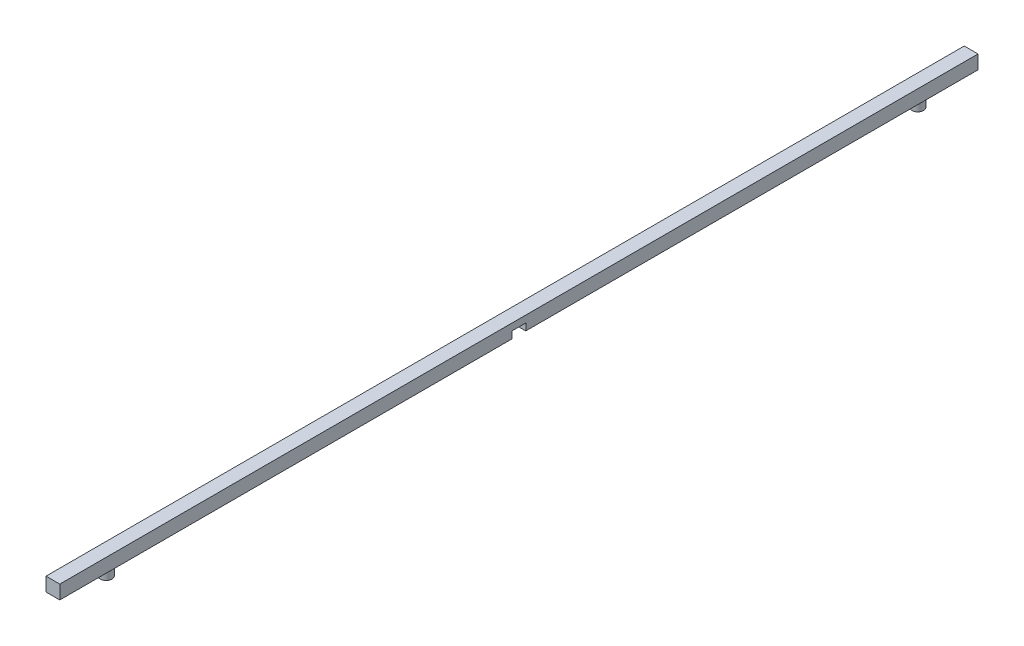
ISO-10303-21;
HEADER;
FILE_DESCRIPTION(('STEP AP214'),'2;1');
FILE_NAME('part.step','',(''),(''),'','','');
FILE_SCHEMA(('AUTOMOTIVE_DESIGN { 1 0 10303 214 1 1 1 1 }'));
ENDSEC;
DATA;
#1=APPLICATION_CONTEXT('core data for automotive mechanical design processes');
#2=APPLICATION_PROTOCOL_DEFINITION('international standard','automotive_design',2000,#1);
#3=PRODUCT_CONTEXT('',#1,'mechanical');
#4=PRODUCT('Part','Part','',(#3));
#5=PRODUCT_RELATED_PRODUCT_CATEGORY('part','',(#4));
#6=PRODUCT_DEFINITION_FORMATION('','',#4);
#7=PRODUCT_DEFINITION_CONTEXT('part definition',#1,'design');
#8=PRODUCT_DEFINITION('design','',#6,#7);
#9=PRODUCT_DEFINITION_SHAPE('','',#8);
#10=(LENGTH_UNIT() NAMED_UNIT(*) SI_UNIT(.MILLI.,.METRE.));
#11=(NAMED_UNIT(*) PLANE_ANGLE_UNIT() SI_UNIT($,.RADIAN.));
#12=(NAMED_UNIT(*) SI_UNIT($,.STERADIAN.) SOLID_ANGLE_UNIT());
#13=UNCERTAINTY_MEASURE_WITH_UNIT(LENGTH_MEASURE(1.E-05),#10,'distance_accuracy_value','');
#14=(GEOMETRIC_REPRESENTATION_CONTEXT(3) GLOBAL_UNCERTAINTY_ASSIGNED_CONTEXT((#13)) GLOBAL_UNIT_ASSIGNED_CONTEXT((#10,
#11,#12)) REPRESENTATION_CONTEXT('',''));
#15=CARTESIAN_POINT('',(0.,0.,0.));
#16=DIRECTION('',(0.,0.,1.));
#17=DIRECTION('',(1.,0.,0.));
#18=AXIS2_PLACEMENT_3D('',#15,#16,#17);
#19=CARTESIAN_POINT('',(30.,0.,-1000.));
#20=DIRECTION('',(0.,1.,0.));
#21=DIRECTION('',(0.,0.,1.));
#22=AXIS2_PLACEMENT_3D('',#19,#20,#21);
#23=PLANE('',#22);
#24=DIRECTION('',(0.,0.,-1.));
#25=VECTOR('',#24,1.);
#26=CARTESIAN_POINT('',(0.,0.,-1000.));
#27=LINE('',#26,#25);
#28=CARTESIAN_POINT('',(0.,-1.21226149872888E-13,-15.));
#29=VERTEX_POINT('',#28);
#30=CARTESIAN_POINT('',(0.,0.,-1000.));
#31=VERTEX_POINT('',#30);
#32=EDGE_CURVE('E129',#29,#31,#27,.T.);
#33=ORIENTED_EDGE('',*,*,#32,.T.);
#34=DIRECTION('',(-1.,0.,0.));
#35=VECTOR('',#34,1.);
#36=CARTESIAN_POINT('',(30.,0.,-1000.));
#37=LINE('',#36,#35);
#38=CARTESIAN_POINT('',(30.,0.,-1000.));
#39=VERTEX_POINT('',#38);
#40=EDGE_CURVE('E126',#39,#31,#37,.T.);
#41=ORIENTED_EDGE('',*,*,#40,.F.);
#42=DIRECTION('',(0.,0.,-1.));
#43=VECTOR('',#42,1.);
#44=CARTESIAN_POINT('',(30.,0.,-1000.));
#45=LINE('',#44,#43);
#46=CARTESIAN_POINT('',(30.,-1.21226149872888E-13,-15.));
#47=VERTEX_POINT('',#46);
#48=EDGE_CURVE('E114',#47,#39,#45,.T.);
#49=ORIENTED_EDGE('',*,*,#48,.F.);
#50=DIRECTION('',(-1.,0.,0.));
#51=VECTOR('',#50,1.);
#52=CARTESIAN_POINT('',(30.,-1.21226149872888E-13,-15.));
#53=LINE('',#52,#51);
#54=EDGE_CURVE('E131',#47,#29,#53,.T.);
#55=ORIENTED_EDGE('',*,*,#54,.T.);
#56=EDGE_LOOP('',(#33,#41,#49,#55));
#57=FACE_BOUND('',#56,.T.);
#58=CARTESIAN_POINT('',(15.0000000000002,0.,-883.8834765));
#59=DIRECTION('',(0.,1.,0.));
#60=DIRECTION('',(0.,0.,1.));
#61=AXIS2_PLACEMENT_3D('',#58,#59,#60);
#62=CIRCLE('',#61,12.5);
#63=CARTESIAN_POINT('',(15.0000000000002,0.,-871.3834765));
#64=VERTEX_POINT('',#63);
#65=EDGE_CURVE('E11',#64,#64,#62,.F.);
#66=ORIENTED_EDGE('',*,*,#65,.F.);
#67=EDGE_LOOP('',(#66));
#68=FACE_BOUND('',#67,.T.);
#69=ADVANCED_FACE('F39',(#57,#68),#23,.F.);
#70=CARTESIAN_POINT('',(30.,-1.2490009027033E-13,15.));
#71=DIRECTION('',(0.,1.,0.));
#72=DIRECTION('',(0.,0.,1.));
#73=AXIS2_PLACEMENT_3D('',#70,#71,#72);
#74=PLANE('',#73);
#75=DIRECTION('',(0.,0.,-1.));
#76=VECTOR('',#75,1.);
#77=CARTESIAN_POINT('',(0.,-1.2490009027033E-13,15.));
#78=LINE('',#77,#76);
#79=CARTESIAN_POINT('',(0.,-2.35922392732846E-13,1000.));
#80=VERTEX_POINT('',#79);
#81=CARTESIAN_POINT('',(0.,-1.2490009027033E-13,15.));
#82=VERTEX_POINT('',#81);
#83=EDGE_CURVE('E146',#80,#82,#78,.T.);
#84=ORIENTED_EDGE('',*,*,#83,.T.);
#85=DIRECTION('',(-1.,0.,0.));
#86=VECTOR('',#85,1.);
#87=CARTESIAN_POINT('',(30.,-1.2490009027033E-13,15.));
#88=LINE('',#87,#86);
#89=CARTESIAN_POINT('',(30.,-1.2490009027033E-13,15.));
#90=VERTEX_POINT('',#89);
#91=EDGE_CURVE('E180',#90,#82,#88,.T.);
#92=ORIENTED_EDGE('',*,*,#91,.F.);
#93=DIRECTION('',(0.,0.,-1.));
#94=VECTOR('',#93,1.);
#95=CARTESIAN_POINT('',(30.,-1.2490009027033E-13,15.));
#96=LINE('',#95,#94);
#97=CARTESIAN_POINT('',(30.,-2.35922392732846E-13,1000.));
#98=VERTEX_POINT('',#97);
#99=EDGE_CURVE('E101',#98,#90,#96,.T.);
#100=ORIENTED_EDGE('',*,*,#99,.F.);
#101=DIRECTION('',(-1.,0.,0.));
#102=VECTOR('',#101,1.);
#103=CARTESIAN_POINT('',(30.,-2.35922392732846E-13,1000.));
#104=LINE('',#103,#102);
#105=EDGE_CURVE('E184',#98,#80,#104,.T.);
#106=ORIENTED_EDGE('',*,*,#105,.T.);
#107=EDGE_LOOP('',(#84,#92,#100,#106));
#108=FACE_BOUND('',#107,.T.);
#109=CARTESIAN_POINT('',(15.,-2.22044604925031E-13,883.8834765));
#110=DIRECTION('',(0.,1.,0.));
#111=DIRECTION('',(0.,0.,1.));
#112=AXIS2_PLACEMENT_3D('',#109,#110,#111);
#113=CIRCLE('',#112,12.5);
#114=CARTESIAN_POINT('',(15.,-2.2345351739283E-13,896.3834765));
#115=VERTEX_POINT('',#114);
#116=EDGE_CURVE('E49',#115,#115,#113,.F.);
#117=ORIENTED_EDGE('',*,*,#116,.F.);
#118=EDGE_LOOP('',(#117));
#119=FACE_BOUND('',#118,.T.);
#120=ADVANCED_FACE('F192',(#108,#119),#74,.F.);
#121=CARTESIAN_POINT('',(30.,-2.35922392732846E-13,1000.));
#122=DIRECTION('',(0.,0.,-1.));
#123=DIRECTION('',(-1.,0.,0.));
#124=AXIS2_PLACEMENT_3D('',#121,#122,#123);
#125=PLANE('',#124);
#126=DIRECTION('',(0.,-1.,0.));
#127=VECTOR('',#126,1.);
#128=CARTESIAN_POINT('',(0.,-2.35922392732846E-13,1000.));
#129=LINE('',#128,#127);
#130=CARTESIAN_POINT('',(0.,29.9999999999998,1000.));
#131=VERTEX_POINT('',#130);
#132=EDGE_CURVE('E142',#131,#80,#129,.T.);
#133=ORIENTED_EDGE('',*,*,#132,.T.);
#134=ORIENTED_EDGE('',*,*,#105,.F.);
#135=DIRECTION('',(0.,-1.,0.));
#136=VECTOR('',#135,1.);
#137=CARTESIAN_POINT('',(30.,-2.35922392732846E-13,1000.));
#138=LINE('',#137,#136);
#139=CARTESIAN_POINT('',(30.,29.9999999999998,1000.));
#140=VERTEX_POINT('',#139);
#141=EDGE_CURVE('E165',#140,#98,#138,.T.);
#142=ORIENTED_EDGE('',*,*,#141,.F.);
#143=DIRECTION('',(-1.,0.,0.));
#144=VECTOR('',#143,1.);
#145=CARTESIAN_POINT('',(30.,29.9999999999998,1000.));
#146=LINE('',#145,#144);
#147=EDGE_CURVE('E138',#140,#131,#146,.T.);
#148=ORIENTED_EDGE('',*,*,#147,.T.);
#149=EDGE_LOOP('',(#133,#134,#142,#148));
#150=FACE_BOUND('',#149,.T.);
#151=ADVANCED_FACE('F41',(#150),#125,.F.);
#152=CARTESIAN_POINT('',(30.,-1.2490009027033E-13,15.));
#153=DIRECTION('',(0.,0.,1.));
#154=DIRECTION('',(1.,0.,0.));
#155=AXIS2_PLACEMENT_3D('',#152,#153,#154);
#156=PLANE('',#155);
#157=DIRECTION('',(0.,1.,0.));
#158=VECTOR('',#157,1.);
#159=CARTESIAN_POINT('',(0.,-1.2490009027033E-13,15.));
#160=LINE('',#159,#158);
#161=CARTESIAN_POINT('',(0.,14.9999999999999,15.));
#162=VERTEX_POINT('',#161);
#163=EDGE_CURVE('E150',#82,#162,#160,.T.);
#164=ORIENTED_EDGE('',*,*,#163,.T.);
#165=DIRECTION('',(-1.,0.,0.));
#166=VECTOR('',#165,1.);
#167=CARTESIAN_POINT('',(30.,14.9999999999999,15.));
#168=LINE('',#167,#166);
#169=CARTESIAN_POINT('',(30.,14.9999999999999,15.));
#170=VERTEX_POINT('',#169);
#171=EDGE_CURVE('E176',#170,#162,#168,.T.);
#172=ORIENTED_EDGE('',*,*,#171,.F.);
#173=DIRECTION('',(0.,1.,0.));
#174=VECTOR('',#173,1.);
#175=CARTESIAN_POINT('',(30.,-1.2490009027033E-13,15.));
#176=LINE('',#175,#174);
#177=EDGE_CURVE('E288',#90,#170,#176,.T.);
#178=ORIENTED_EDGE('',*,*,#177,.F.);
#179=ORIENTED_EDGE('',*,*,#91,.T.);
#180=EDGE_LOOP('',(#164,#172,#178,#179));
#181=FACE_BOUND('',#180,.T.);
#182=ADVANCED_FACE('F198',(#181),#156,.F.);
#183=CARTESIAN_POINT('',(30.,14.9999999999999,15.));
#184=DIRECTION('',(0.,1.,0.));
#185=DIRECTION('',(0.,0.,1.));
#186=AXIS2_PLACEMENT_3D('',#183,#184,#185);
#187=PLANE('',#186);
#188=DIRECTION('',(0.,0.,-1.));
#189=VECTOR('',#188,1.);
#190=CARTESIAN_POINT('',(0.,14.9999999999999,15.));
#191=LINE('',#190,#189);
#192=CARTESIAN_POINT('',(0.,14.9999999999999,-15.));
#193=VERTEX_POINT('',#192);
#194=EDGE_CURVE('E153',#162,#193,#191,.T.);
#195=ORIENTED_EDGE('',*,*,#194,.T.);
#196=DIRECTION('',(-1.,0.,0.));
#197=VECTOR('',#196,1.);
#198=CARTESIAN_POINT('',(30.,14.9999999999999,-15.));
#199=LINE('',#198,#197);
#200=CARTESIAN_POINT('',(30.,14.9999999999999,-15.));
#201=VERTEX_POINT('',#200);
#202=EDGE_CURVE('E172',#201,#193,#199,.T.);
#203=ORIENTED_EDGE('',*,*,#202,.F.);
#204=DIRECTION('',(0.,0.,-1.));
#205=VECTOR('',#204,1.);
#206=CARTESIAN_POINT('',(30.,14.9999999999999,15.));
#207=LINE('',#206,#205);
#208=EDGE_CURVE('E291',#170,#201,#207,.T.);
#209=ORIENTED_EDGE('',*,*,#208,.F.);
#210=ORIENTED_EDGE('',*,*,#171,.T.);
#211=EDGE_LOOP('',(#195,#203,#209,#210));
#212=FACE_BOUND('',#211,.T.);
#213=ADVANCED_FACE('F204',(#212),#187,.F.);
#214=CARTESIAN_POINT('',(30.,14.9999999999999,-15.));
#215=DIRECTION('',(0.,0.,-1.));
#216=DIRECTION('',(-1.,0.,0.));
#217=AXIS2_PLACEMENT_3D('',#214,#215,#216);
#218=PLANE('',#217);
#219=DIRECTION('',(0.,-1.,0.));
#220=VECTOR('',#219,1.);
#221=CARTESIAN_POINT('',(0.,14.9999999999999,-15.));
#222=LINE('',#221,#220);
#223=EDGE_CURVE('E156',#193,#29,#222,.T.);
#224=ORIENTED_EDGE('',*,*,#223,.T.);
#225=ORIENTED_EDGE('',*,*,#54,.F.);
#226=DIRECTION('',(0.,-1.,0.));
#227=VECTOR('',#226,1.);
#228=CARTESIAN_POINT('',(30.,14.9999999999999,-15.));
#229=LINE('',#228,#227);
#230=EDGE_CURVE('E120',#201,#47,#229,.T.);
#231=ORIENTED_EDGE('',*,*,#230,.F.);
#232=ORIENTED_EDGE('',*,*,#202,.T.);
#233=EDGE_LOOP('',(#224,#225,#231,#232));
#234=FACE_BOUND('',#233,.T.);
#235=ADVANCED_FACE('F208',(#234),#218,.F.);
#236=CARTESIAN_POINT('',(30.,30.,-1000.));
#237=DIRECTION('',(0.,0.,1.));
#238=DIRECTION('',(1.,0.,0.));
#239=AXIS2_PLACEMENT_3D('',#236,#237,#238);
#240=PLANE('',#239);
#241=DIRECTION('',(0.,1.,0.));
#242=VECTOR('',#241,1.);
#243=CARTESIAN_POINT('',(0.,30.,-1000.));
#244=LINE('',#243,#242);
#245=CARTESIAN_POINT('',(0.,30.,-1000.));
#246=VERTEX_POINT('',#245);
#247=EDGE_CURVE('E86',#31,#246,#244,.T.);
#248=ORIENTED_EDGE('',*,*,#247,.T.);
#249=DIRECTION('',(-1.,0.,0.));
#250=VECTOR('',#249,1.);
#251=CARTESIAN_POINT('',(30.,30.,-1000.));
#252=LINE('',#251,#250);
#253=CARTESIAN_POINT('',(30.,30.,-1000.));
#254=VERTEX_POINT('',#253);
#255=EDGE_CURVE('E132',#254,#246,#252,.T.);
#256=ORIENTED_EDGE('',*,*,#255,.F.);
#257=DIRECTION('',(0.,1.,0.));
#258=VECTOR('',#257,1.);
#259=CARTESIAN_POINT('',(30.,30.,-1000.));
#260=LINE('',#259,#258);
#261=EDGE_CURVE('E118',#39,#254,#260,.T.);
#262=ORIENTED_EDGE('',*,*,#261,.F.);
#263=ORIENTED_EDGE('',*,*,#40,.T.);
#264=EDGE_LOOP('',(#248,#256,#262,#263));
#265=FACE_BOUND('',#264,.T.);
#266=ADVANCED_FACE('F134',(#265),#240,.F.);
#267=CARTESIAN_POINT('',(30.,29.9999999999998,1000.));
#268=DIRECTION('',(0.,-1.,0.));
#269=DIRECTION('',(0.,0.,-1.));
#270=AXIS2_PLACEMENT_3D('',#267,#268,#269);
#271=PLANE('',#270);
#272=DIRECTION('',(0.,0.,1.));
#273=VECTOR('',#272,1.);
#274=CARTESIAN_POINT('',(0.,29.9999999999998,1000.));
#275=LINE('',#274,#273);
#276=EDGE_CURVE('E92',#246,#131,#275,.T.);
#277=ORIENTED_EDGE('',*,*,#276,.T.);
#278=ORIENTED_EDGE('',*,*,#147,.F.);
#279=DIRECTION('',(0.,0.,1.));
#280=VECTOR('',#279,1.);
#281=CARTESIAN_POINT('',(30.,29.9999999999998,1000.));
#282=LINE('',#281,#280);
#283=EDGE_CURVE('E57',#254,#140,#282,.T.);
#284=ORIENTED_EDGE('',*,*,#283,.F.);
#285=ORIENTED_EDGE('',*,*,#255,.T.);
#286=EDGE_LOOP('',(#277,#278,#284,#285));
#287=FACE_BOUND('',#286,.T.);
#288=ADVANCED_FACE('F215',(#287),#271,.F.);
#289=CARTESIAN_POINT('',(30.,0.,0.));
#290=DIRECTION('',(-1.,0.,0.));
#291=DIRECTION('',(0.,0.,1.));
#292=AXIS2_PLACEMENT_3D('',#289,#290,#291);
#293=PLANE('',#292);
#294=ORIENTED_EDGE('',*,*,#141,.T.);
#295=ORIENTED_EDGE('',*,*,#99,.T.);
#296=ORIENTED_EDGE('',*,*,#177,.T.);
#297=ORIENTED_EDGE('',*,*,#208,.T.);
#298=ORIENTED_EDGE('',*,*,#230,.T.);
#299=ORIENTED_EDGE('',*,*,#48,.T.);
#300=ORIENTED_EDGE('',*,*,#261,.T.);
#301=ORIENTED_EDGE('',*,*,#283,.T.);
#302=EDGE_LOOP('',(#294,#295,#296,#297,#298,#299,#300,#301));
#303=FACE_BOUND('',#302,.T.);
#304=ADVANCED_FACE('F116',(#303),#293,.F.);
#305=CARTESIAN_POINT('',(0.,0.,0.));
#306=DIRECTION('',(-1.,0.,0.));
#307=DIRECTION('',(0.,0.,1.));
#308=AXIS2_PLACEMENT_3D('',#305,#306,#307);
#309=PLANE('',#308);
#310=ORIENTED_EDGE('',*,*,#132,.F.);
#311=ORIENTED_EDGE('',*,*,#276,.F.);
#312=ORIENTED_EDGE('',*,*,#247,.F.);
#313=ORIENTED_EDGE('',*,*,#32,.F.);
#314=ORIENTED_EDGE('',*,*,#223,.F.);
#315=ORIENTED_EDGE('',*,*,#194,.F.);
#316=ORIENTED_EDGE('',*,*,#163,.F.);
#317=ORIENTED_EDGE('',*,*,#83,.F.);
#318=EDGE_LOOP('',(#310,#311,#312,#313,#314,#315,#316,#317));
#319=FACE_BOUND('',#318,.T.);
#320=ADVANCED_FACE('F218',(#319),#309,.T.);
#321=CARTESIAN_POINT('',(15.,-20.0000000000001,883.8834765));
#322=DIRECTION('',(0.,-1.,0.));
#323=DIRECTION('',(0.,0.,-1.));
#324=AXIS2_PLACEMENT_3D('',#321,#322,#323);
#325=PLANE('',#324);
#326=CARTESIAN_POINT('',(15.,-20.0000000000001,883.8834765));
#327=DIRECTION('',(0.,-1.,0.));
#328=DIRECTION('',(0.,0.,-1.));
#329=AXIS2_PLACEMENT_3D('',#326,#327,#328);
#330=CIRCLE('',#329,12.5);
#331=CARTESIAN_POINT('',(15.,-20.0000000000001,871.3834765));
#332=VERTEX_POINT('',#331);
#333=EDGE_CURVE('E273',#332,#332,#330,.T.);
#334=ORIENTED_EDGE('',*,*,#333,.T.);
#335=EDGE_LOOP('',(#334));
#336=FACE_BOUND('',#335,.T.);
#337=CARTESIAN_POINT('',(15.,-20.0000000000001,883.8834765));
#338=DIRECTION('',(0.,-1.,0.));
#339=DIRECTION('',(0.,0.,-1.));
#340=AXIS2_PLACEMENT_3D('',#337,#338,#339);
#341=CIRCLE('',#340,10.);
#342=CARTESIAN_POINT('',(15.,-20.0000000000001,873.8834765));
#343=VERTEX_POINT('',#342);
#344=EDGE_CURVE('E267',#343,#343,#341,.T.);
#345=ORIENTED_EDGE('',*,*,#344,.F.);
#346=EDGE_LOOP('',(#345));
#347=FACE_BOUND('',#346,.T.);
#348=ADVANCED_FACE('F221',(#336,#347),#325,.T.);
#349=CARTESIAN_POINT('',(15.,-20.0000000000001,883.8834765));
#350=DIRECTION('',(0.,1.,0.));
#351=DIRECTION('',(0.,0.,1.));
#352=AXIS2_PLACEMENT_3D('',#349,#350,#351);
#353=CYLINDRICAL_SURFACE('',#352,12.5);
#354=ORIENTED_EDGE('',*,*,#333,.F.);
#355=EDGE_LOOP('',(#354));
#356=FACE_BOUND('',#355,.T.);
#357=ORIENTED_EDGE('',*,*,#116,.T.);
#358=EDGE_LOOP('',(#357));
#359=FACE_BOUND('',#358,.T.);
#360=ADVANCED_FACE('F190',(#356,#359),#353,.T.);
#361=CARTESIAN_POINT('',(15.,14.9999999999999,883.8834765));
#362=DIRECTION('',(0.,-1.,0.));
#363=DIRECTION('',(0.,0.,-1.));
#364=AXIS2_PLACEMENT_3D('',#361,#362,#363);
#365=PLANE('',#364);
#366=CARTESIAN_POINT('',(15.,14.9999999999999,883.8834765));
#367=DIRECTION('',(0.,-1.,0.));
#368=DIRECTION('',(0.,0.,-1.));
#369=AXIS2_PLACEMENT_3D('',#366,#367,#368);
#370=CIRCLE('',#369,10.);
#371=CARTESIAN_POINT('',(15.,14.9999999999999,873.8834765));
#372=VERTEX_POINT('',#371);
#373=EDGE_CURVE('E147',#372,#372,#370,.T.);
#374=ORIENTED_EDGE('',*,*,#373,.T.);
#375=EDGE_LOOP('',(#374));
#376=FACE_BOUND('',#375,.T.);
#377=ADVANCED_FACE('F238',(#376),#365,.T.);
#378=CARTESIAN_POINT('',(15.,14.9999999999999,883.8834765));
#379=DIRECTION('',(0.,-1.,0.));
#380=DIRECTION('',(0.,0.,-1.));
#381=AXIS2_PLACEMENT_3D('',#378,#379,#380);
#382=CYLINDRICAL_SURFACE('',#381,10.);
#383=ORIENTED_EDGE('',*,*,#373,.F.);
#384=EDGE_LOOP('',(#383));
#385=FACE_BOUND('',#384,.T.);
#386=ORIENTED_EDGE('',*,*,#344,.T.);
#387=EDGE_LOOP('',(#386));
#388=FACE_BOUND('',#387,.T.);
#389=ADVANCED_FACE('F234',(#385,#388),#382,.F.);
#390=CARTESIAN_POINT('',(15.0000000000002,-19.9999999999999,-883.8834765));
#391=DIRECTION('',(0.,1.,0.));
#392=DIRECTION('',(0.,0.,1.));
#393=AXIS2_PLACEMENT_3D('',#390,#391,#392);
#394=PLANE('',#393);
#395=CARTESIAN_POINT('',(15.0000000000002,-19.9999999999999,-883.8834765));
#396=DIRECTION('',(0.,-1.,0.));
#397=DIRECTION('',(0.,0.,1.));
#398=AXIS2_PLACEMENT_3D('',#395,#396,#397);
#399=CIRCLE('',#398,12.5);
#400=CARTESIAN_POINT('',(15.0000000000002,-19.9999999999999,-871.3834765));
#401=VERTEX_POINT('',#400);
#402=EDGE_CURVE('E259',#401,#401,#399,.T.);
#403=ORIENTED_EDGE('',*,*,#402,.T.);
#404=EDGE_LOOP('',(#403));
#405=FACE_BOUND('',#404,.T.);
#406=CARTESIAN_POINT('',(15.0000000000002,-19.9999999999999,-883.8834765));
#407=DIRECTION('',(0.,-1.,0.));
#408=DIRECTION('',(0.,0.,1.));
#409=AXIS2_PLACEMENT_3D('',#406,#407,#408);
#410=CIRCLE('',#409,10.);
#411=CARTESIAN_POINT('',(15.0000000000002,-19.9999999999999,-873.8834765));
#412=VERTEX_POINT('',#411);
#413=EDGE_CURVE('E262',#412,#412,#410,.T.);
#414=ORIENTED_EDGE('',*,*,#413,.F.);
#415=EDGE_LOOP('',(#414));
#416=FACE_BOUND('',#415,.T.);
#417=ADVANCED_FACE('F237',(#405,#416),#394,.F.);
#418=CARTESIAN_POINT('',(15.0000000000002,-19.9999999999999,-883.8834765));
#419=DIRECTION('',(0.,1.,0.));
#420=DIRECTION('',(0.,0.,1.));
#421=AXIS2_PLACEMENT_3D('',#418,#419,#420);
#422=CYLINDRICAL_SURFACE('',#421,12.5);
#423=ORIENTED_EDGE('',*,*,#402,.F.);
#424=EDGE_LOOP('',(#423));
#425=FACE_BOUND('',#424,.T.);
#426=ORIENTED_EDGE('',*,*,#65,.T.);
#427=EDGE_LOOP('',(#426));
#428=FACE_BOUND('',#427,.T.);
#429=ADVANCED_FACE('F232',(#425,#428),#422,.T.);
#430=CARTESIAN_POINT('',(15.,15.0000000000001,-883.8834765));
#431=DIRECTION('',(0.,1.,0.));
#432=DIRECTION('',(0.,0.,1.));
#433=AXIS2_PLACEMENT_3D('',#430,#431,#432);
#434=PLANE('',#433);
#435=CARTESIAN_POINT('',(15.,15.0000000000001,-883.8834765));
#436=DIRECTION('',(0.,-1.,0.));
#437=DIRECTION('',(0.,0.,1.));
#438=AXIS2_PLACEMENT_3D('',#435,#436,#437);
#439=CIRCLE('',#438,10.);
#440=CARTESIAN_POINT('',(15.,15.0000000000001,-873.8834765));
#441=VERTEX_POINT('',#440);
#442=EDGE_CURVE('E277',#441,#441,#439,.T.);
#443=ORIENTED_EDGE('',*,*,#442,.T.);
#444=EDGE_LOOP('',(#443));
#445=FACE_BOUND('',#444,.T.);
#446=ADVANCED_FACE('F228',(#445),#434,.F.);
#447=CARTESIAN_POINT('',(15.,15.0000000000001,-883.8834765));
#448=DIRECTION('',(0.,-1.,0.));
#449=DIRECTION('',(0.,0.,-1.));
#450=AXIS2_PLACEMENT_3D('',#447,#448,#449);
#451=CYLINDRICAL_SURFACE('',#450,10.);
#452=ORIENTED_EDGE('',*,*,#442,.F.);
#453=EDGE_LOOP('',(#452));
#454=FACE_BOUND('',#453,.T.);
#455=ORIENTED_EDGE('',*,*,#413,.T.);
#456=EDGE_LOOP('',(#455));
#457=FACE_BOUND('',#456,.T.);
#458=ADVANCED_FACE('F225',(#454,#457),#451,.F.);
#459=CLOSED_SHELL('',(#69,#120,#151,#182,#213,#235,#266,#288,#304,#320,#348,#360,#377,#389,#417,
#429,#446,#458));
#460=MANIFOLD_SOLID_BREP('B2',#459);
#461=ADVANCED_BREP_SHAPE_REPRESENTATION('',(#18,#460),#14);
#462=SHAPE_DEFINITION_REPRESENTATION(#9,#461);
ENDSEC;
END-ISO-10303-21;
